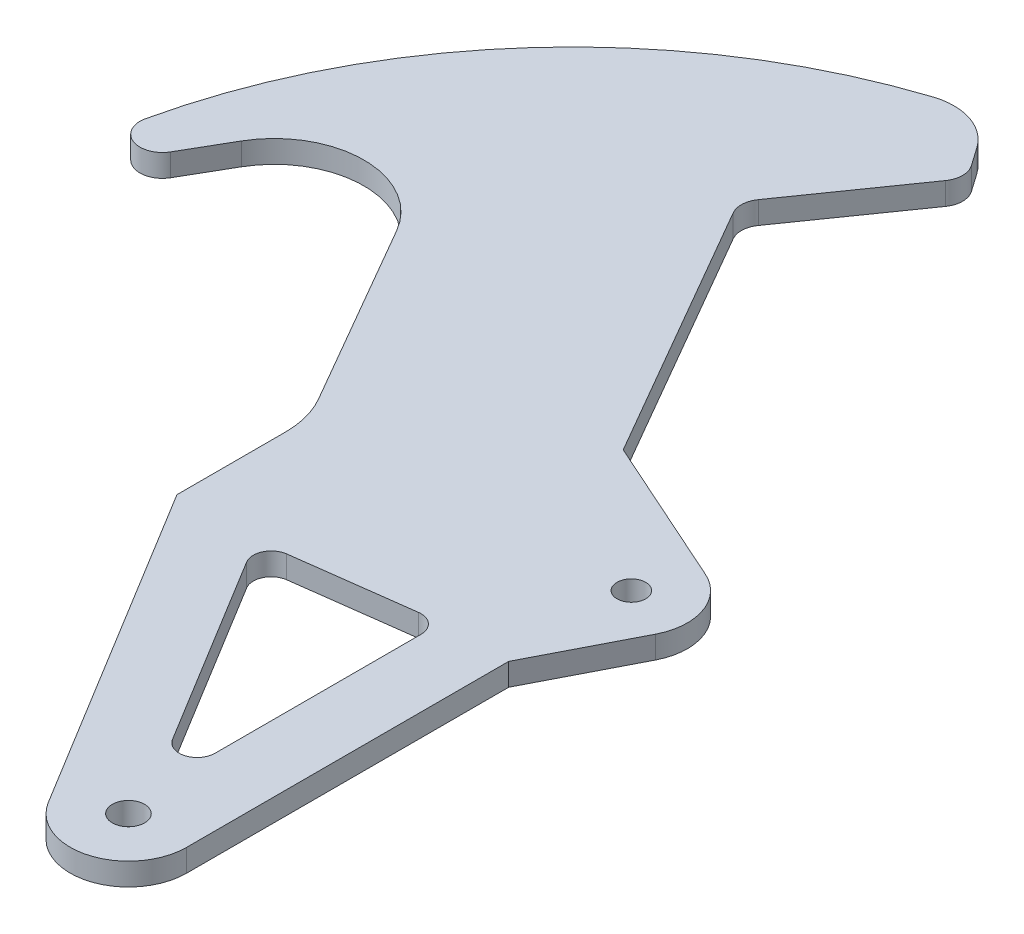
ISO-10303-21;
HEADER;
FILE_DESCRIPTION(('STEP AP214'),'2;1');
FILE_NAME('part.step','',(''),(''),'','','');
FILE_SCHEMA(('AUTOMOTIVE_DESIGN { 1 0 10303 214 1 1 1 1 }'));
ENDSEC;
DATA;
#1=APPLICATION_CONTEXT('core data for automotive mechanical design processes');
#2=APPLICATION_PROTOCOL_DEFINITION('international standard','automotive_design',2000,#1);
#3=PRODUCT_CONTEXT('',#1,'mechanical');
#4=PRODUCT('Part','Part','',(#3));
#5=PRODUCT_RELATED_PRODUCT_CATEGORY('part','',(#4));
#6=PRODUCT_DEFINITION_FORMATION('','',#4);
#7=PRODUCT_DEFINITION_CONTEXT('part definition',#1,'design');
#8=PRODUCT_DEFINITION('design','',#6,#7);
#9=PRODUCT_DEFINITION_SHAPE('','',#8);
#10=(LENGTH_UNIT() NAMED_UNIT(*) SI_UNIT(.MILLI.,.METRE.));
#11=(NAMED_UNIT(*) PLANE_ANGLE_UNIT() SI_UNIT($,.RADIAN.));
#12=(NAMED_UNIT(*) SI_UNIT($,.STERADIAN.) SOLID_ANGLE_UNIT());
#13=UNCERTAINTY_MEASURE_WITH_UNIT(LENGTH_MEASURE(1.E-05),#10,'distance_accuracy_value','');
#14=(GEOMETRIC_REPRESENTATION_CONTEXT(3) GLOBAL_UNCERTAINTY_ASSIGNED_CONTEXT((#13)) GLOBAL_UNIT_ASSIGNED_CONTEXT((#10,
#11,#12)) REPRESENTATION_CONTEXT('',''));
#15=CARTESIAN_POINT('',(0.,0.,0.));
#16=DIRECTION('',(0.,0.,1.));
#17=DIRECTION('',(1.,0.,0.));
#18=AXIS2_PLACEMENT_3D('',#15,#16,#17);
#19=CARTESIAN_POINT('',(0.,3.175,-17.4625));
#20=DIRECTION('',(0.,-1.,0.));
#21=DIRECTION('',(0.,0.,-1.));
#22=AXIS2_PLACEMENT_3D('',#19,#20,#21);
#23=PLANE('',#22);
#24=DIRECTION('',(0.,0.,-1.));
#25=VECTOR('',#24,1.);
#26=CARTESIAN_POINT('',(62.23,3.175,21.0815421831651));
#27=LINE('',#26,#25);
#28=CARTESIAN_POINT('',(62.23,3.175,53.1350747203319));
#29=VERTEX_POINT('',#28);
#30=CARTESIAN_POINT('',(62.23,3.175,23.9764163032682));
#31=VERTEX_POINT('',#30);
#32=EDGE_CURVE('E299',#29,#31,#27,.T.);
#33=ORIENTED_EDGE('',*,*,#32,.F.);
#34=CARTESIAN_POINT('',(59.69,3.175,53.1350747203319));
#35=DIRECTION('',(0.,-1.,0.));
#36=DIRECTION('',(0.,0.,-1.));
#37=AXIS2_PLACEMENT_3D('',#34,#35,#36);
#38=CIRCLE('',#37,2.54);
#39=CARTESIAN_POINT('',(57.5227237778206,3.175,54.4596553244386));
#40=VERTEX_POINT('',#39);
#41=EDGE_CURVE('E57',#29,#40,#38,.T.);
#42=ORIENTED_EDGE('',*,*,#41,.T.);
#43=DIRECTION('',(0.521488426813693,0.,0.853258355188731));
#44=VECTOR('',#43,1.);
#45=CARTESIAN_POINT('',(62.23,3.175,62.1616915734439));
#46=LINE('',#45,#44);
#47=CARTESIAN_POINT('',(41.0241922292437,3.175,27.4647899193097));
#48=VERTEX_POINT('',#47);
#49=EDGE_CURVE('E297',#48,#40,#46,.T.);
#50=ORIENTED_EDGE('',*,*,#49,.F.);
#51=CARTESIAN_POINT('',(43.1914684514231,3.175,26.1402093152029));
#52=DIRECTION('',(0.,-1.,0.));
#53=DIRECTION('',(0.,0.,-1.));
#54=AXIS2_PLACEMENT_3D('',#51,#52,#53);
#55=CIRCLE('',#54,2.54);
#56=CARTESIAN_POINT('',(42.8611743192099,3.175,23.6217761145351));
#57=VERTEX_POINT('',#56);
#58=EDGE_CURVE('E289',#48,#57,#55,.T.);
#59=ORIENTED_EDGE('',*,*,#58,.T.);
#60=DIRECTION('',(-0.991509134121156,0.,0.130037059926449));
#61=VECTOR('',#60,1.);
#62=CARTESIAN_POINT('',(38.9860588336554,3.175,24.13));
#63=LINE('',#62,#61);
#64=CARTESIAN_POINT('',(59.3597058677868,3.175,21.4579831026005));
#65=VERTEX_POINT('',#64);
#66=EDGE_CURVE('E324',#65,#57,#63,.T.);
#67=ORIENTED_EDGE('',*,*,#66,.F.);
#68=CARTESIAN_POINT('',(59.69,3.175,23.9764163032682));
#69=DIRECTION('',(0.,-1.,0.));
#70=DIRECTION('',(0.,0.,-1.));
#71=AXIS2_PLACEMENT_3D('',#68,#69,#70);
#72=CIRCLE('',#71,2.54);
#73=EDGE_CURVE('E283',#65,#31,#72,.T.);
#74=ORIENTED_EDGE('',*,*,#73,.T.);
#75=EDGE_LOOP('',(#33,#42,#50,#59,#67,#74));
#76=FACE_BOUND('',#75,.T.);
#77=CARTESIAN_POINT('',(0.,3.175,-17.4625));
#78=DIRECTION('',(0.,-1.,0.));
#79=DIRECTION('',(0.,0.,-1.));
#80=AXIS2_PLACEMENT_3D('',#77,#78,#79);
#81=CIRCLE('',#80,12.7000000000001);
#82=CARTESIAN_POINT('',(-10.9985226280625,3.175,-23.8125));
#83=VERTEX_POINT('',#82);
#84=CARTESIAN_POINT('',(10.9985226280624,3.175,-23.8125));
#85=VERTEX_POINT('',#84);
#86=EDGE_CURVE('E241',#83,#85,#81,.T.);
#87=ORIENTED_EDGE('',*,*,#86,.T.);
#88=DIRECTION('',(0.500000000000001,0.,0.866025403784438));
#89=VECTOR('',#88,1.);
#90=CARTESIAN_POINT('',(10.9985226280624,3.175,-23.8125));
#91=LINE('',#90,#89);
#92=CARTESIAN_POINT('',(26.1214912416482,3.175,2.38124999999995));
#93=VERTEX_POINT('',#92);
#94=EDGE_CURVE('E229',#85,#93,#91,.T.);
#95=ORIENTED_EDGE('',*,*,#94,.T.);
#96=CARTESIAN_POINT('',(15.1229686135857,3.175,8.73125));
#97=DIRECTION('',(0.,-1.,0.));
#98=DIRECTION('',(0.,0.,-1.));
#99=AXIS2_PLACEMENT_3D('',#96,#97,#98);
#100=CIRCLE('',#99,12.7000000000001);
#101=CARTESIAN_POINT('',(27.8229686135858,3.175,8.73125));
#102=VERTEX_POINT('',#101);
#103=EDGE_CURVE('E240',#93,#102,#100,.T.);
#104=ORIENTED_EDGE('',*,*,#103,.T.);
#105=DIRECTION('',(0.,0.,1.));
#106=VECTOR('',#105,1.);
#107=CARTESIAN_POINT('',(27.8229686135859,3.175,8.73125));
#108=LINE('',#107,#106);
#109=CARTESIAN_POINT('',(27.8229686135858,3.175,24.13));
#110=VERTEX_POINT('',#109);
#111=EDGE_CURVE('E349',#102,#110,#108,.T.);
#112=ORIENTED_EDGE('',*,*,#111,.T.);
#113=DIRECTION('',(0.521488426813693,0.,0.853258355188732));
#114=VECTOR('',#113,1.);
#115=CARTESIAN_POINT('',(27.8229686135858,3.175,24.13));
#116=LINE('',#115,#114);
#117=CARTESIAN_POINT('',(56.456352277917,3.175,70.979886963347));
#118=VERTEX_POINT('',#117);
#119=EDGE_CURVE('E352',#110,#118,#116,.T.);
#120=ORIENTED_EDGE('',*,*,#119,.T.);
#121=CARTESIAN_POINT('',(63.5,3.175,66.675));
#122=DIRECTION('',(0.,1.,0.));
#123=DIRECTION('',(0.,0.,1.));
#124=AXIS2_PLACEMENT_3D('',#121,#122,#123);
#125=CIRCLE('',#124,8.25500000000001);
#126=CARTESIAN_POINT('',(71.755,3.175,66.675));
#127=VERTEX_POINT('',#126);
#128=EDGE_CURVE('E355',#118,#127,#125,.T.);
#129=ORIENTED_EDGE('',*,*,#128,.T.);
#130=DIRECTION('',(0.,0.,-1.));
#131=VECTOR('',#130,1.);
#132=CARTESIAN_POINT('',(71.755,3.175,66.675));
#133=LINE('',#132,#131);
#134=CARTESIAN_POINT('',(71.755,3.175,21.0815421831651));
#135=VERTEX_POINT('',#134);
#136=EDGE_CURVE('E358',#127,#135,#133,.T.);
#137=ORIENTED_EDGE('',*,*,#136,.T.);
#138=DIRECTION('',(0.457027054721787,0.,-0.889452793155617));
#139=VECTOR('',#138,1.);
#140=CARTESIAN_POINT('',(71.755,3.175,21.0815421831651));
#141=LINE('',#140,#139);
#142=CARTESIAN_POINT('',(78.8150315456727,3.175,7.34151363739771));
#143=VERTEX_POINT('',#142);
#144=EDGE_CURVE('E361',#135,#143,#141,.T.);
#145=ORIENTED_EDGE('',*,*,#144,.T.);
#146=CARTESIAN_POINT('',(71.755,3.175,3.71386139054353));
#147=DIRECTION('',(0.,1.,0.));
#148=DIRECTION('',(0.,0.,1.));
#149=AXIS2_PLACEMENT_3D('',#146,#147,#148);
#150=CIRCLE('',#149,7.93750000000001);
#151=CARTESIAN_POINT('',(74.9982461501024,3.175,-3.53080980005209));
#152=VERTEX_POINT('',#151);
#153=EDGE_CURVE('E364',#143,#152,#150,.T.);
#154=ORIENTED_EDGE('',*,*,#153,.T.);
#155=DIRECTION('',(-0.912714480704959,0.,-0.408597940170379));
#156=VECTOR('',#155,1.);
#157=CARTESIAN_POINT('',(74.9982461501024,3.175,-3.53080980005209));
#158=LINE('',#157,#156);
#159=CARTESIAN_POINT('',(53.9226018811694,3.175,-12.9658138655057));
#160=VERTEX_POINT('',#159);
#161=EDGE_CURVE('E367',#152,#160,#158,.T.);
#162=ORIENTED_EDGE('',*,*,#161,.T.);
#163=DIRECTION('',(-0.5,0.,-0.866025403784439));
#164=VECTOR('',#163,1.);
#165=CARTESIAN_POINT('',(32.6501018811694,3.175,-49.8108646695147));
#166=LINE('',#165,#164);
#167=CARTESIAN_POINT('',(32.6501018811694,3.175,-49.8108646695147));
#168=VERTEX_POINT('',#167);
#169=EDGE_CURVE('E370',#160,#168,#166,.T.);
#170=ORIENTED_EDGE('',*,*,#169,.T.);
#171=CARTESIAN_POINT('',(35.399732538185,3.175,-51.3983646695146));
#172=DIRECTION('',(0.,-1.,0.));
#173=DIRECTION('',(0.,0.,1.));
#174=AXIS2_PLACEMENT_3D('',#171,#172,#173);
#175=CIRCLE('',#174,3.175);
#176=CARTESIAN_POINT('',(32.7989247975674,3.175,-53.2194698549292));
#177=VERTEX_POINT('',#176);
#178=EDGE_CURVE('E373',#168,#177,#175,.T.);
#179=ORIENTED_EDGE('',*,*,#178,.T.);
#180=DIRECTION('',(0.573576436351042,0.,-0.819152044288994));
#181=VECTOR('',#180,1.);
#182=CARTESIAN_POINT('',(32.7989247975674,3.175,-53.2194698549292));
#183=LINE('',#182,#181);
#184=CARTESIAN_POINT('',(43.7255559100548,3.175,-68.8243162986346));
#185=VERTEX_POINT('',#184);
#186=EDGE_CURVE('E376',#177,#185,#183,.T.);
#187=ORIENTED_EDGE('',*,*,#186,.T.);
#188=CARTESIAN_POINT('',(41.1247481694372,3.175,-70.6454214840491));
#189=DIRECTION('',(0.,1.,0.));
#190=DIRECTION('',(0.,0.,1.));
#191=AXIS2_PLACEMENT_3D('',#188,#189,#190);
#192=CIRCLE('',#191,3.175);
#193=CARTESIAN_POINT('',(43.7255559100548,3.175,-72.4665266694637));
#194=VERTEX_POINT('',#193);
#195=EDGE_CURVE('E379',#185,#194,#192,.T.);
#196=ORIENTED_EDGE('',*,*,#195,.T.);
#197=DIRECTION('',(-0.573576436351042,0.,-0.819152044288995));
#198=VECTOR('',#197,1.);
#199=CARTESIAN_POINT('',(41.9044507246402,3.175,-75.0673344100812));
#200=LINE('',#199,#198);
#201=CARTESIAN_POINT('',(41.9044507246402,3.175,-75.0673344100812));
#202=VERTEX_POINT('',#201);
#203=EDGE_CURVE('E382',#194,#202,#200,.T.);
#204=ORIENTED_EDGE('',*,*,#203,.T.);
#205=CARTESIAN_POINT('',(35.1423505990346,3.175,-70.3324609280034));
#206=DIRECTION('',(0.,1.,0.));
#207=DIRECTION('',(0.,0.,1.));
#208=AXIS2_PLACEMENT_3D('',#205,#206,#207);
#209=CIRCLE('',#208,8.25499999999999);
#210=CARTESIAN_POINT('',(32.5941511916014,3.175,-78.1843208847243));
#211=VERTEX_POINT('',#210);
#212=EDGE_CURVE('E385',#202,#211,#209,.T.);
#213=ORIENTED_EDGE('',*,*,#212,.T.);
#214=CARTESIAN_POINT('',(57.15,3.175,-2.51948657092369));
#215=DIRECTION('',(0.,1.,0.));
#216=DIRECTION('',(0.,0.,-1.));
#217=AXIS2_PLACEMENT_3D('',#214,#215,#216);
#218=CIRCLE('',#217,79.5497131511851);
#219=CARTESIAN_POINT('',(-20.514067317038,3.175,-19.7371957742535));
#220=VERTEX_POINT('',#219);
#221=EDGE_CURVE('E388',#211,#220,#218,.T.);
#222=ORIENTED_EDGE('',*,*,#221,.T.);
#223=CARTESIAN_POINT('',(-17.4143274944322,3.175,-19.05));
#224=DIRECTION('',(0.,1.,0.));
#225=DIRECTION('',(0.,0.,1.));
#226=AXIS2_PLACEMENT_3D('',#223,#224,#225);
#227=CIRCLE('',#226,3.175);
#228=CARTESIAN_POINT('',(-14.6646968374166,3.175,-17.4625));
#229=VERTEX_POINT('',#228);
#230=EDGE_CURVE('E391',#220,#229,#227,.T.);
#231=ORIENTED_EDGE('',*,*,#230,.T.);
#232=DIRECTION('',(0.500000000000004,0.,-0.866025403784436));
#233=VECTOR('',#232,1.);
#234=CARTESIAN_POINT('',(-10.9985226280625,3.175,-23.8125));
#235=LINE('',#234,#233);
#236=EDGE_CURVE('E246',#229,#83,#235,.T.);
#237=ORIENTED_EDGE('',*,*,#236,.T.);
#238=EDGE_LOOP('',(#87,#95,#104,#112,#120,#129,#137,#145,#154,#162,#170,#179,#187,#196,#204,
#213,#222,#231,#237));
#239=FACE_BOUND('',#238,.T.);
#240=CARTESIAN_POINT('',(63.5,3.175,66.675));
#241=DIRECTION('',(0.,1.,0.));
#242=DIRECTION('',(0.,0.,1.));
#243=AXIS2_PLACEMENT_3D('',#240,#241,#242);
#244=CIRCLE('',#243,2.28599999999998);
#245=CARTESIAN_POINT('',(63.5,3.175,68.961));
#246=VERTEX_POINT('',#245);
#247=EDGE_CURVE('E340',#246,#246,#244,.T.);
#248=ORIENTED_EDGE('',*,*,#247,.F.);
#249=EDGE_LOOP('',(#248));
#250=FACE_BOUND('',#249,.T.);
#251=CARTESIAN_POINT('',(71.755,3.175,3.71386139054353));
#252=DIRECTION('',(0.,1.,0.));
#253=DIRECTION('',(0.,0.,1.));
#254=AXIS2_PLACEMENT_3D('',#251,#252,#253);
#255=CIRCLE('',#254,2.03200000000001);
#256=CARTESIAN_POINT('',(71.755,3.175,5.74586139054353));
#257=VERTEX_POINT('',#256);
#258=EDGE_CURVE('E332',#257,#257,#255,.T.);
#259=ORIENTED_EDGE('',*,*,#258,.F.);
#260=EDGE_LOOP('',(#259));
#261=FACE_BOUND('',#260,.T.);
#262=ADVANCED_FACE('F48',(#76,#239,#250,#261),#23,.F.);
#263=CARTESIAN_POINT('',(0.,0.,-17.4625));
#264=DIRECTION('',(0.,-1.,0.));
#265=DIRECTION('',(0.,0.,-1.));
#266=AXIS2_PLACEMENT_3D('',#263,#264,#265);
#267=PLANE('',#266);
#268=DIRECTION('',(-0.991509134121156,0.,0.130037059926449));
#269=VECTOR('',#268,1.);
#270=CARTESIAN_POINT('',(38.9860588336554,0.,24.13));
#271=LINE('',#270,#269);
#272=CARTESIAN_POINT('',(59.3597058677868,0.,21.4579831026005));
#273=VERTEX_POINT('',#272);
#274=CARTESIAN_POINT('',(42.8611743192099,0.,23.6217761145351));
#275=VERTEX_POINT('',#274);
#276=EDGE_CURVE('E318',#273,#275,#271,.T.);
#277=ORIENTED_EDGE('',*,*,#276,.T.);
#278=CARTESIAN_POINT('',(43.1914684514231,0.,26.1402093152029));
#279=DIRECTION('',(0.,-1.,0.));
#280=DIRECTION('',(0.,0.,-1.));
#281=AXIS2_PLACEMENT_3D('',#278,#279,#280);
#282=CIRCLE('',#281,2.54);
#283=CARTESIAN_POINT('',(41.0241922292437,0.,27.4647899193097));
#284=VERTEX_POINT('',#283);
#285=EDGE_CURVE('E71',#275,#284,#282,.F.);
#286=ORIENTED_EDGE('',*,*,#285,.T.);
#287=DIRECTION('',(0.521488426813693,0.,0.853258355188731));
#288=VECTOR('',#287,1.);
#289=CARTESIAN_POINT('',(62.23,0.,62.1616915734439));
#290=LINE('',#289,#288);
#291=CARTESIAN_POINT('',(57.5227237778206,0.,54.4596553244386));
#292=VERTEX_POINT('',#291);
#293=EDGE_CURVE('E313',#284,#292,#290,.T.);
#294=ORIENTED_EDGE('',*,*,#293,.T.);
#295=CARTESIAN_POINT('',(59.69,0.,53.1350747203319));
#296=DIRECTION('',(0.,-1.,0.));
#297=DIRECTION('',(0.,0.,-1.));
#298=AXIS2_PLACEMENT_3D('',#295,#296,#297);
#299=CIRCLE('',#298,2.54);
#300=CARTESIAN_POINT('',(62.23,0.,53.1350747203319));
#301=VERTEX_POINT('',#300);
#302=EDGE_CURVE('E11',#292,#301,#299,.F.);
#303=ORIENTED_EDGE('',*,*,#302,.T.);
#304=DIRECTION('',(0.,0.,-1.));
#305=VECTOR('',#304,1.);
#306=CARTESIAN_POINT('',(62.23,0.,21.0815421831651));
#307=LINE('',#306,#305);
#308=CARTESIAN_POINT('',(62.23,0.,23.9764163032682));
#309=VERTEX_POINT('',#308);
#310=EDGE_CURVE('E311',#301,#309,#307,.T.);
#311=ORIENTED_EDGE('',*,*,#310,.T.);
#312=CARTESIAN_POINT('',(59.69,0.,23.9764163032682));
#313=DIRECTION('',(0.,-1.,0.));
#314=DIRECTION('',(0.,0.,-1.));
#315=AXIS2_PLACEMENT_3D('',#312,#313,#314);
#316=CIRCLE('',#315,2.54);
#317=EDGE_CURVE('E286',#309,#273,#316,.F.);
#318=ORIENTED_EDGE('',*,*,#317,.T.);
#319=EDGE_LOOP('',(#277,#286,#294,#303,#311,#318));
#320=FACE_BOUND('',#319,.T.);
#321=CARTESIAN_POINT('',(63.5,0.,66.675));
#322=DIRECTION('',(0.,1.,0.));
#323=DIRECTION('',(0.,0.,1.));
#324=AXIS2_PLACEMENT_3D('',#321,#322,#323);
#325=CIRCLE('',#324,2.28599999999998);
#326=CARTESIAN_POINT('',(63.5,0.,68.961));
#327=VERTEX_POINT('',#326);
#328=EDGE_CURVE('E336',#327,#327,#325,.T.);
#329=ORIENTED_EDGE('',*,*,#328,.T.);
#330=EDGE_LOOP('',(#329));
#331=FACE_BOUND('',#330,.T.);
#332=CARTESIAN_POINT('',(0.,0.,-17.4625));
#333=DIRECTION('',(0.,-1.,0.));
#334=DIRECTION('',(0.,0.,-1.));
#335=AXIS2_PLACEMENT_3D('',#332,#333,#334);
#336=CIRCLE('',#335,12.7000000000001);
#337=CARTESIAN_POINT('',(-10.9985226280625,0.,-23.8125));
#338=VERTEX_POINT('',#337);
#339=CARTESIAN_POINT('',(10.9985226280624,0.,-23.8125));
#340=VERTEX_POINT('',#339);
#341=EDGE_CURVE('E255',#338,#340,#336,.T.);
#342=ORIENTED_EDGE('',*,*,#341,.F.);
#343=DIRECTION('',(0.500000000000004,0.,-0.866025403784436));
#344=VECTOR('',#343,1.);
#345=CARTESIAN_POINT('',(-10.9985226280625,0.,-23.8125));
#346=LINE('',#345,#344);
#347=CARTESIAN_POINT('',(-14.6646968374166,0.,-17.4625));
#348=VERTEX_POINT('',#347);
#349=EDGE_CURVE('E251',#348,#338,#346,.T.);
#350=ORIENTED_EDGE('',*,*,#349,.F.);
#351=CARTESIAN_POINT('',(-17.4143274944322,0.,-19.05));
#352=DIRECTION('',(0.,1.,0.));
#353=DIRECTION('',(0.,0.,1.));
#354=AXIS2_PLACEMENT_3D('',#351,#352,#353);
#355=CIRCLE('',#354,3.175);
#356=CARTESIAN_POINT('',(-20.514067317038,0.,-19.7371957742535));
#357=VERTEX_POINT('',#356);
#358=EDGE_CURVE('E447',#357,#348,#355,.T.);
#359=ORIENTED_EDGE('',*,*,#358,.F.);
#360=CARTESIAN_POINT('',(57.15,0.,-2.51948657092369));
#361=DIRECTION('',(0.,1.,0.));
#362=DIRECTION('',(0.,0.,-1.));
#363=AXIS2_PLACEMENT_3D('',#360,#361,#362);
#364=CIRCLE('',#363,79.5497131511851);
#365=CARTESIAN_POINT('',(32.5941511916014,0.,-78.1843208847243));
#366=VERTEX_POINT('',#365);
#367=EDGE_CURVE('E444',#366,#357,#364,.T.);
#368=ORIENTED_EDGE('',*,*,#367,.F.);
#369=CARTESIAN_POINT('',(35.1423505990346,0.,-70.3324609280034));
#370=DIRECTION('',(0.,1.,0.));
#371=DIRECTION('',(0.,0.,1.));
#372=AXIS2_PLACEMENT_3D('',#369,#370,#371);
#373=CIRCLE('',#372,8.25499999999999);
#374=CARTESIAN_POINT('',(41.9044507246402,0.,-75.0673344100812));
#375=VERTEX_POINT('',#374);
#376=EDGE_CURVE('E441',#375,#366,#373,.T.);
#377=ORIENTED_EDGE('',*,*,#376,.F.);
#378=DIRECTION('',(-0.573576436351042,0.,-0.819152044288995));
#379=VECTOR('',#378,1.);
#380=CARTESIAN_POINT('',(41.9044507246402,0.,-75.0673344100812));
#381=LINE('',#380,#379);
#382=CARTESIAN_POINT('',(43.7255559100548,0.,-72.4665266694637));
#383=VERTEX_POINT('',#382);
#384=EDGE_CURVE('E438',#383,#375,#381,.T.);
#385=ORIENTED_EDGE('',*,*,#384,.F.);
#386=CARTESIAN_POINT('',(41.1247481694372,0.,-70.6454214840491));
#387=DIRECTION('',(0.,1.,0.));
#388=DIRECTION('',(0.,0.,1.));
#389=AXIS2_PLACEMENT_3D('',#386,#387,#388);
#390=CIRCLE('',#389,3.175);
#391=CARTESIAN_POINT('',(43.7255559100548,0.,-68.8243162986346));
#392=VERTEX_POINT('',#391);
#393=EDGE_CURVE('E435',#392,#383,#390,.T.);
#394=ORIENTED_EDGE('',*,*,#393,.F.);
#395=DIRECTION('',(0.573576436351042,0.,-0.819152044288994));
#396=VECTOR('',#395,1.);
#397=CARTESIAN_POINT('',(32.7989247975674,0.,-53.2194698549292));
#398=LINE('',#397,#396);
#399=CARTESIAN_POINT('',(32.7989247975674,0.,-53.2194698549292));
#400=VERTEX_POINT('',#399);
#401=EDGE_CURVE('E432',#400,#392,#398,.T.);
#402=ORIENTED_EDGE('',*,*,#401,.F.);
#403=CARTESIAN_POINT('',(35.399732538185,0.,-51.3983646695146));
#404=DIRECTION('',(0.,-1.,0.));
#405=DIRECTION('',(0.,0.,1.));
#406=AXIS2_PLACEMENT_3D('',#403,#404,#405);
#407=CIRCLE('',#406,3.175);
#408=CARTESIAN_POINT('',(32.6501018811694,0.,-49.8108646695147));
#409=VERTEX_POINT('',#408);
#410=EDGE_CURVE('E429',#409,#400,#407,.T.);
#411=ORIENTED_EDGE('',*,*,#410,.F.);
#412=DIRECTION('',(-0.5,0.,-0.866025403784439));
#413=VECTOR('',#412,1.);
#414=CARTESIAN_POINT('',(32.6501018811694,0.,-49.8108646695147));
#415=LINE('',#414,#413);
#416=CARTESIAN_POINT('',(53.9226018811694,0.,-12.9658138655057));
#417=VERTEX_POINT('',#416);
#418=EDGE_CURVE('E426',#417,#409,#415,.T.);
#419=ORIENTED_EDGE('',*,*,#418,.F.);
#420=DIRECTION('',(-0.912714480704959,0.,-0.408597940170379));
#421=VECTOR('',#420,1.);
#422=CARTESIAN_POINT('',(74.9982461501024,0.,-3.53080980005209));
#423=LINE('',#422,#421);
#424=CARTESIAN_POINT('',(74.9982461501024,0.,-3.53080980005209));
#425=VERTEX_POINT('',#424);
#426=EDGE_CURVE('E423',#425,#417,#423,.T.);
#427=ORIENTED_EDGE('',*,*,#426,.F.);
#428=CARTESIAN_POINT('',(71.755,0.,3.71386139054353));
#429=DIRECTION('',(0.,1.,0.));
#430=DIRECTION('',(0.,0.,1.));
#431=AXIS2_PLACEMENT_3D('',#428,#429,#430);
#432=CIRCLE('',#431,7.93750000000001);
#433=CARTESIAN_POINT('',(78.8150315456727,0.,7.34151363739771));
#434=VERTEX_POINT('',#433);
#435=EDGE_CURVE('E420',#434,#425,#432,.T.);
#436=ORIENTED_EDGE('',*,*,#435,.F.);
#437=DIRECTION('',(0.457027054721787,0.,-0.889452793155617));
#438=VECTOR('',#437,1.);
#439=CARTESIAN_POINT('',(71.755,0.,21.0815421831651));
#440=LINE('',#439,#438);
#441=CARTESIAN_POINT('',(71.755,0.,21.0815421831651));
#442=VERTEX_POINT('',#441);
#443=EDGE_CURVE('E417',#442,#434,#440,.T.);
#444=ORIENTED_EDGE('',*,*,#443,.F.);
#445=DIRECTION('',(0.,0.,-1.));
#446=VECTOR('',#445,1.);
#447=CARTESIAN_POINT('',(71.755,0.,66.675));
#448=LINE('',#447,#446);
#449=CARTESIAN_POINT('',(71.755,0.,66.675));
#450=VERTEX_POINT('',#449);
#451=EDGE_CURVE('E414',#450,#442,#448,.T.);
#452=ORIENTED_EDGE('',*,*,#451,.F.);
#453=CARTESIAN_POINT('',(63.5,0.,66.675));
#454=DIRECTION('',(0.,1.,0.));
#455=DIRECTION('',(0.,0.,1.));
#456=AXIS2_PLACEMENT_3D('',#453,#454,#455);
#457=CIRCLE('',#456,8.25500000000001);
#458=CARTESIAN_POINT('',(56.456352277917,0.,70.979886963347));
#459=VERTEX_POINT('',#458);
#460=EDGE_CURVE('E411',#459,#450,#457,.T.);
#461=ORIENTED_EDGE('',*,*,#460,.F.);
#462=DIRECTION('',(0.521488426813693,0.,0.853258355188732));
#463=VECTOR('',#462,1.);
#464=CARTESIAN_POINT('',(27.8229686135858,0.,24.13));
#465=LINE('',#464,#463);
#466=CARTESIAN_POINT('',(27.8229686135858,0.,24.13));
#467=VERTEX_POINT('',#466);
#468=EDGE_CURVE('E408',#467,#459,#465,.T.);
#469=ORIENTED_EDGE('',*,*,#468,.F.);
#470=DIRECTION('',(0.,0.,1.));
#471=VECTOR('',#470,1.);
#472=CARTESIAN_POINT('',(27.8229686135859,0.,8.73125));
#473=LINE('',#472,#471);
#474=CARTESIAN_POINT('',(27.8229686135858,0.,8.73125));
#475=VERTEX_POINT('',#474);
#476=EDGE_CURVE('E405',#475,#467,#473,.T.);
#477=ORIENTED_EDGE('',*,*,#476,.F.);
#478=CARTESIAN_POINT('',(15.1229686135857,0.,8.73125));
#479=DIRECTION('',(0.,-1.,0.));
#480=DIRECTION('',(0.,0.,-1.));
#481=AXIS2_PLACEMENT_3D('',#478,#479,#480);
#482=CIRCLE('',#481,12.7000000000001);
#483=CARTESIAN_POINT('',(26.1214912416482,0.,2.38124999999995));
#484=VERTEX_POINT('',#483);
#485=EDGE_CURVE('E402',#484,#475,#482,.T.);
#486=ORIENTED_EDGE('',*,*,#485,.F.);
#487=DIRECTION('',(0.500000000000001,0.,0.866025403784438));
#488=VECTOR('',#487,1.);
#489=CARTESIAN_POINT('',(10.9985226280624,0.,-23.8125));
#490=LINE('',#489,#488);
#491=EDGE_CURVE('E399',#340,#484,#490,.T.);
#492=ORIENTED_EDGE('',*,*,#491,.F.);
#493=EDGE_LOOP('',(#342,#350,#359,#368,#377,#385,#394,#402,#411,#419,#427,#436,#444,#452,#461,
#469,#477,#486,#492));
#494=FACE_BOUND('',#493,.T.);
#495=CARTESIAN_POINT('',(71.755,0.,3.71386139054353));
#496=DIRECTION('',(0.,1.,0.));
#497=DIRECTION('',(0.,0.,1.));
#498=AXIS2_PLACEMENT_3D('',#495,#496,#497);
#499=CIRCLE('',#498,2.03200000000001);
#500=CARTESIAN_POINT('',(71.755,0.,5.74586139054353));
#501=VERTEX_POINT('',#500);
#502=EDGE_CURVE('E321',#501,#501,#499,.T.);
#503=ORIENTED_EDGE('',*,*,#502,.T.);
#504=EDGE_LOOP('',(#503));
#505=FACE_BOUND('',#504,.T.);
#506=ADVANCED_FACE('F309',(#320,#331,#494,#505),#267,.T.);
#507=CARTESIAN_POINT('',(0.,3.175,-17.4625));
#508=DIRECTION('',(0.,-1.,0.));
#509=DIRECTION('',(0.,0.,-1.));
#510=AXIS2_PLACEMENT_3D('',#507,#508,#509);
#511=CYLINDRICAL_SURFACE('',#510,12.7000000000001);
#512=ORIENTED_EDGE('',*,*,#341,.T.);
#513=DIRECTION('',(0.,-1.,0.));
#514=VECTOR('',#513,1.);
#515=CARTESIAN_POINT('',(10.9985226280624,3.175,-23.8125));
#516=LINE('',#515,#514);
#517=EDGE_CURVE('E233',#85,#340,#516,.T.);
#518=ORIENTED_EDGE('',*,*,#517,.F.);
#519=ORIENTED_EDGE('',*,*,#86,.F.);
#520=DIRECTION('',(0.,-1.,0.));
#521=VECTOR('',#520,1.);
#522=CARTESIAN_POINT('',(-10.9985226280625,3.175,-23.8125));
#523=LINE('',#522,#521);
#524=EDGE_CURVE('E396',#83,#338,#523,.T.);
#525=ORIENTED_EDGE('',*,*,#524,.T.);
#526=EDGE_LOOP('',(#512,#518,#519,#525));
#527=FACE_BOUND('',#526,.T.);
#528=ADVANCED_FACE('F253',(#527),#511,.F.);
#529=CARTESIAN_POINT('',(10.9985226280624,3.175,-23.8125));
#530=DIRECTION('',(0.866025403784438,0.,-0.500000000000001));
#531=DIRECTION('',(-0.500000000000001,0.,-0.866025403784438));
#532=AXIS2_PLACEMENT_3D('',#529,#530,#531);
#533=PLANE('',#532);
#534=ORIENTED_EDGE('',*,*,#491,.T.);
#535=DIRECTION('',(0.,-1.,0.));
#536=VECTOR('',#535,1.);
#537=CARTESIAN_POINT('',(26.1214912416482,3.175,2.38124999999995));
#538=LINE('',#537,#536);
#539=EDGE_CURVE('E236',#93,#484,#538,.T.);
#540=ORIENTED_EDGE('',*,*,#539,.F.);
#541=ORIENTED_EDGE('',*,*,#94,.F.);
#542=ORIENTED_EDGE('',*,*,#517,.T.);
#543=EDGE_LOOP('',(#534,#540,#541,#542));
#544=FACE_BOUND('',#543,.T.);
#545=ADVANCED_FACE('F231',(#544),#533,.F.);
#546=CARTESIAN_POINT('',(15.1229686135857,3.175,8.73125));
#547=DIRECTION('',(0.,-1.,0.));
#548=DIRECTION('',(0.,0.,-1.));
#549=AXIS2_PLACEMENT_3D('',#546,#547,#548);
#550=CYLINDRICAL_SURFACE('',#549,12.7000000000001);
#551=ORIENTED_EDGE('',*,*,#485,.T.);
#552=DIRECTION('',(0.,-1.,0.));
#553=VECTOR('',#552,1.);
#554=CARTESIAN_POINT('',(27.8229686135858,3.175,8.73125));
#555=LINE('',#554,#553);
#556=EDGE_CURVE('E263',#102,#475,#555,.T.);
#557=ORIENTED_EDGE('',*,*,#556,.F.);
#558=ORIENTED_EDGE('',*,*,#103,.F.);
#559=ORIENTED_EDGE('',*,*,#539,.T.);
#560=EDGE_LOOP('',(#551,#557,#558,#559));
#561=FACE_BOUND('',#560,.T.);
#562=ADVANCED_FACE('F538',(#561),#550,.F.);
#563=CARTESIAN_POINT('',(27.8229686135859,3.175,8.73125));
#564=DIRECTION('',(1.,0.,0.));
#565=DIRECTION('',(0.,0.,-1.));
#566=AXIS2_PLACEMENT_3D('',#563,#564,#565);
#567=PLANE('',#566);
#568=ORIENTED_EDGE('',*,*,#476,.T.);
#569=DIRECTION('',(0.,-1.,0.));
#570=VECTOR('',#569,1.);
#571=CARTESIAN_POINT('',(27.8229686135858,3.175,24.13));
#572=LINE('',#571,#570);
#573=EDGE_CURVE('E510',#110,#467,#572,.T.);
#574=ORIENTED_EDGE('',*,*,#573,.F.);
#575=ORIENTED_EDGE('',*,*,#111,.F.);
#576=ORIENTED_EDGE('',*,*,#556,.T.);
#577=EDGE_LOOP('',(#568,#574,#575,#576));
#578=FACE_BOUND('',#577,.T.);
#579=ADVANCED_FACE('F519',(#578),#567,.F.);
#580=CARTESIAN_POINT('',(27.8229686135858,3.175,24.13));
#581=DIRECTION('',(0.853258355188732,0.,-0.521488426813693));
#582=DIRECTION('',(-0.521488426813693,0.,-0.853258355188732));
#583=AXIS2_PLACEMENT_3D('',#580,#581,#582);
#584=PLANE('',#583);
#585=ORIENTED_EDGE('',*,*,#468,.T.);
#586=DIRECTION('',(0.,-1.,0.));
#587=VECTOR('',#586,1.);
#588=CARTESIAN_POINT('',(56.456352277917,3.175,70.979886963347));
#589=LINE('',#588,#587);
#590=EDGE_CURVE('E506',#118,#459,#589,.T.);
#591=ORIENTED_EDGE('',*,*,#590,.F.);
#592=ORIENTED_EDGE('',*,*,#119,.F.);
#593=ORIENTED_EDGE('',*,*,#573,.T.);
#594=EDGE_LOOP('',(#585,#591,#592,#593));
#595=FACE_BOUND('',#594,.T.);
#596=ADVANCED_FACE('F530',(#595),#584,.F.);
#597=CARTESIAN_POINT('',(63.5,3.175,66.675));
#598=DIRECTION('',(0.,-1.,0.));
#599=DIRECTION('',(0.,0.,-1.));
#600=AXIS2_PLACEMENT_3D('',#597,#598,#599);
#601=CYLINDRICAL_SURFACE('',#600,8.25500000000001);
#602=ORIENTED_EDGE('',*,*,#460,.T.);
#603=DIRECTION('',(0.,-1.,0.));
#604=VECTOR('',#603,1.);
#605=CARTESIAN_POINT('',(71.755,3.175,66.675));
#606=LINE('',#605,#604);
#607=EDGE_CURVE('E502',#127,#450,#606,.T.);
#608=ORIENTED_EDGE('',*,*,#607,.F.);
#609=ORIENTED_EDGE('',*,*,#128,.F.);
#610=ORIENTED_EDGE('',*,*,#590,.T.);
#611=EDGE_LOOP('',(#602,#608,#609,#610));
#612=FACE_BOUND('',#611,.T.);
#613=ADVANCED_FACE('F534',(#612),#601,.T.);
#614=CARTESIAN_POINT('',(71.755,3.175,66.675));
#615=DIRECTION('',(-1.,0.,0.));
#616=DIRECTION('',(0.,0.,1.));
#617=AXIS2_PLACEMENT_3D('',#614,#615,#616);
#618=PLANE('',#617);
#619=ORIENTED_EDGE('',*,*,#451,.T.);
#620=DIRECTION('',(0.,-1.,0.));
#621=VECTOR('',#620,1.);
#622=CARTESIAN_POINT('',(71.755,3.175,21.0815421831651));
#623=LINE('',#622,#621);
#624=EDGE_CURVE('E498',#135,#442,#623,.T.);
#625=ORIENTED_EDGE('',*,*,#624,.F.);
#626=ORIENTED_EDGE('',*,*,#136,.F.);
#627=ORIENTED_EDGE('',*,*,#607,.T.);
#628=EDGE_LOOP('',(#619,#625,#626,#627));
#629=FACE_BOUND('',#628,.T.);
#630=ADVANCED_FACE('F603',(#629),#618,.F.);
#631=CARTESIAN_POINT('',(71.755,3.175,21.0815421831651));
#632=DIRECTION('',(-0.889452793155617,0.,-0.457027054721787));
#633=DIRECTION('',(-0.457027054721787,0.,0.889452793155617));
#634=AXIS2_PLACEMENT_3D('',#631,#632,#633);
#635=PLANE('',#634);
#636=ORIENTED_EDGE('',*,*,#443,.T.);
#637=DIRECTION('',(0.,-1.,0.));
#638=VECTOR('',#637,1.);
#639=CARTESIAN_POINT('',(78.8150315456727,3.175,7.34151363739771));
#640=LINE('',#639,#638);
#641=EDGE_CURVE('E494',#143,#434,#640,.T.);
#642=ORIENTED_EDGE('',*,*,#641,.F.);
#643=ORIENTED_EDGE('',*,*,#144,.F.);
#644=ORIENTED_EDGE('',*,*,#624,.T.);
#645=EDGE_LOOP('',(#636,#642,#643,#644));
#646=FACE_BOUND('',#645,.T.);
#647=ADVANCED_FACE('F599',(#646),#635,.F.);
#648=CARTESIAN_POINT('',(71.755,3.175,3.71386139054353));
#649=DIRECTION('',(0.,-1.,0.));
#650=DIRECTION('',(0.,0.,-1.));
#651=AXIS2_PLACEMENT_3D('',#648,#649,#650);
#652=CYLINDRICAL_SURFACE('',#651,7.93750000000001);
#653=ORIENTED_EDGE('',*,*,#435,.T.);
#654=DIRECTION('',(0.,-1.,0.));
#655=VECTOR('',#654,1.);
#656=CARTESIAN_POINT('',(74.9982461501024,3.175,-3.53080980005209));
#657=LINE('',#656,#655);
#658=EDGE_CURVE('E490',#152,#425,#657,.T.);
#659=ORIENTED_EDGE('',*,*,#658,.F.);
#660=ORIENTED_EDGE('',*,*,#153,.F.);
#661=ORIENTED_EDGE('',*,*,#641,.T.);
#662=EDGE_LOOP('',(#653,#659,#660,#661));
#663=FACE_BOUND('',#662,.T.);
#664=ADVANCED_FACE('F595',(#663),#652,.T.);
#665=CARTESIAN_POINT('',(74.9982461501024,3.175,-3.53080980005209));
#666=DIRECTION('',(-0.408597940170379,0.,0.912714480704959));
#667=DIRECTION('',(0.912714480704959,0.,0.408597940170379));
#668=AXIS2_PLACEMENT_3D('',#665,#666,#667);
#669=PLANE('',#668);
#670=ORIENTED_EDGE('',*,*,#426,.T.);
#671=DIRECTION('',(0.,-1.,0.));
#672=VECTOR('',#671,1.);
#673=CARTESIAN_POINT('',(53.9226018811694,3.175,-12.9658138655057));
#674=LINE('',#673,#672);
#675=EDGE_CURVE('E486',#160,#417,#674,.T.);
#676=ORIENTED_EDGE('',*,*,#675,.F.);
#677=ORIENTED_EDGE('',*,*,#161,.F.);
#678=ORIENTED_EDGE('',*,*,#658,.T.);
#679=EDGE_LOOP('',(#670,#676,#677,#678));
#680=FACE_BOUND('',#679,.T.);
#681=ADVANCED_FACE('F591',(#680),#669,.F.);
#682=CARTESIAN_POINT('',(32.6501018811694,3.175,-49.8108646695147));
#683=DIRECTION('',(-0.866025403784439,0.,0.5));
#684=DIRECTION('',(0.5,0.,0.866025403784439));
#685=AXIS2_PLACEMENT_3D('',#682,#683,#684);
#686=PLANE('',#685);
#687=ORIENTED_EDGE('',*,*,#418,.T.);
#688=DIRECTION('',(0.,-1.,0.));
#689=VECTOR('',#688,1.);
#690=CARTESIAN_POINT('',(32.6501018811694,3.175,-49.8108646695147));
#691=LINE('',#690,#689);
#692=EDGE_CURVE('E482',#168,#409,#691,.T.);
#693=ORIENTED_EDGE('',*,*,#692,.F.);
#694=ORIENTED_EDGE('',*,*,#169,.F.);
#695=ORIENTED_EDGE('',*,*,#675,.T.);
#696=EDGE_LOOP('',(#687,#693,#694,#695));
#697=FACE_BOUND('',#696,.T.);
#698=ADVANCED_FACE('F587',(#697),#686,.F.);
#699=CARTESIAN_POINT('',(35.399732538185,3.175,-51.3983646695146));
#700=DIRECTION('',(0.,-1.,0.));
#701=DIRECTION('',(0.,0.,-1.));
#702=AXIS2_PLACEMENT_3D('',#699,#700,#701);
#703=CYLINDRICAL_SURFACE('',#702,3.175);
#704=ORIENTED_EDGE('',*,*,#410,.T.);
#705=DIRECTION('',(0.,-1.,0.));
#706=VECTOR('',#705,1.);
#707=CARTESIAN_POINT('',(32.7989247975674,3.175,-53.2194698549292));
#708=LINE('',#707,#706);
#709=EDGE_CURVE('E478',#177,#400,#708,.T.);
#710=ORIENTED_EDGE('',*,*,#709,.F.);
#711=ORIENTED_EDGE('',*,*,#178,.F.);
#712=ORIENTED_EDGE('',*,*,#692,.T.);
#713=EDGE_LOOP('',(#704,#710,#711,#712));
#714=FACE_BOUND('',#713,.T.);
#715=ADVANCED_FACE('F583',(#714),#703,.F.);
#716=CARTESIAN_POINT('',(32.7989247975674,3.175,-53.2194698549292));
#717=DIRECTION('',(-0.819152044288994,0.,-0.573576436351042));
#718=DIRECTION('',(-0.573576436351042,0.,0.819152044288994));
#719=AXIS2_PLACEMENT_3D('',#716,#717,#718);
#720=PLANE('',#719);
#721=ORIENTED_EDGE('',*,*,#401,.T.);
#722=DIRECTION('',(0.,-1.,0.));
#723=VECTOR('',#722,1.);
#724=CARTESIAN_POINT('',(43.7255559100548,3.175,-68.8243162986346));
#725=LINE('',#724,#723);
#726=EDGE_CURVE('E474',#185,#392,#725,.T.);
#727=ORIENTED_EDGE('',*,*,#726,.F.);
#728=ORIENTED_EDGE('',*,*,#186,.F.);
#729=ORIENTED_EDGE('',*,*,#709,.T.);
#730=EDGE_LOOP('',(#721,#727,#728,#729));
#731=FACE_BOUND('',#730,.T.);
#732=ADVANCED_FACE('F579',(#731),#720,.F.);
#733=CARTESIAN_POINT('',(41.1247481694372,3.175,-70.6454214840491));
#734=DIRECTION('',(0.,-1.,0.));
#735=DIRECTION('',(0.,0.,-1.));
#736=AXIS2_PLACEMENT_3D('',#733,#734,#735);
#737=CYLINDRICAL_SURFACE('',#736,3.175);
#738=ORIENTED_EDGE('',*,*,#393,.T.);
#739=DIRECTION('',(0.,-1.,0.));
#740=VECTOR('',#739,1.);
#741=CARTESIAN_POINT('',(43.7255559100548,3.175,-72.4665266694637));
#742=LINE('',#741,#740);
#743=EDGE_CURVE('E470',#194,#383,#742,.T.);
#744=ORIENTED_EDGE('',*,*,#743,.F.);
#745=ORIENTED_EDGE('',*,*,#195,.F.);
#746=ORIENTED_EDGE('',*,*,#726,.T.);
#747=EDGE_LOOP('',(#738,#744,#745,#746));
#748=FACE_BOUND('',#747,.T.);
#749=ADVANCED_FACE('F575',(#748),#737,.T.);
#750=CARTESIAN_POINT('',(41.9044507246402,3.175,-75.0673344100812));
#751=DIRECTION('',(-0.819152044288995,0.,0.573576436351042));
#752=DIRECTION('',(0.573576436351042,0.,0.819152044288995));
#753=AXIS2_PLACEMENT_3D('',#750,#751,#752);
#754=PLANE('',#753);
#755=ORIENTED_EDGE('',*,*,#384,.T.);
#756=DIRECTION('',(0.,-1.,0.));
#757=VECTOR('',#756,1.);
#758=CARTESIAN_POINT('',(41.9044507246402,3.175,-75.0673344100812));
#759=LINE('',#758,#757);
#760=EDGE_CURVE('E466',#202,#375,#759,.T.);
#761=ORIENTED_EDGE('',*,*,#760,.F.);
#762=ORIENTED_EDGE('',*,*,#203,.F.);
#763=ORIENTED_EDGE('',*,*,#743,.T.);
#764=EDGE_LOOP('',(#755,#761,#762,#763));
#765=FACE_BOUND('',#764,.T.);
#766=ADVANCED_FACE('F571',(#765),#754,.F.);
#767=CARTESIAN_POINT('',(35.1423505990346,3.175,-70.3324609280034));
#768=DIRECTION('',(0.,-1.,0.));
#769=DIRECTION('',(0.,0.,-1.));
#770=AXIS2_PLACEMENT_3D('',#767,#768,#769);
#771=CYLINDRICAL_SURFACE('',#770,8.25499999999999);
#772=ORIENTED_EDGE('',*,*,#376,.T.);
#773=DIRECTION('',(0.,-1.,0.));
#774=VECTOR('',#773,1.);
#775=CARTESIAN_POINT('',(32.5941511916014,3.175,-78.1843208847243));
#776=LINE('',#775,#774);
#777=EDGE_CURVE('E462',#211,#366,#776,.T.);
#778=ORIENTED_EDGE('',*,*,#777,.F.);
#779=ORIENTED_EDGE('',*,*,#212,.F.);
#780=ORIENTED_EDGE('',*,*,#760,.T.);
#781=EDGE_LOOP('',(#772,#778,#779,#780));
#782=FACE_BOUND('',#781,.T.);
#783=ADVANCED_FACE('F567',(#782),#771,.T.);
#784=CARTESIAN_POINT('',(57.15,3.175,-2.51948657092369));
#785=DIRECTION('',(0.,-1.,0.));
#786=DIRECTION('',(0.,0.,-1.));
#787=AXIS2_PLACEMENT_3D('',#784,#785,#786);
#788=CYLINDRICAL_SURFACE('',#787,79.5497131511851);
#789=ORIENTED_EDGE('',*,*,#367,.T.);
#790=DIRECTION('',(0.,-1.,0.));
#791=VECTOR('',#790,1.);
#792=CARTESIAN_POINT('',(-20.514067317038,3.175,-19.7371957742535));
#793=LINE('',#792,#791);
#794=EDGE_CURVE('E458',#220,#357,#793,.T.);
#795=ORIENTED_EDGE('',*,*,#794,.F.);
#796=ORIENTED_EDGE('',*,*,#221,.F.);
#797=ORIENTED_EDGE('',*,*,#777,.T.);
#798=EDGE_LOOP('',(#789,#795,#796,#797));
#799=FACE_BOUND('',#798,.T.);
#800=ADVANCED_FACE('F563',(#799),#788,.T.);
#801=CARTESIAN_POINT('',(-17.4143274944322,3.175,-19.05));
#802=DIRECTION('',(0.,-1.,0.));
#803=DIRECTION('',(0.,0.,-1.));
#804=AXIS2_PLACEMENT_3D('',#801,#802,#803);
#805=CYLINDRICAL_SURFACE('',#804,3.175);
#806=ORIENTED_EDGE('',*,*,#358,.T.);
#807=DIRECTION('',(0.,-1.,0.));
#808=VECTOR('',#807,1.);
#809=CARTESIAN_POINT('',(-14.6646968374166,3.175,-17.4625));
#810=LINE('',#809,#808);
#811=EDGE_CURVE('E454',#229,#348,#810,.T.);
#812=ORIENTED_EDGE('',*,*,#811,.F.);
#813=ORIENTED_EDGE('',*,*,#230,.F.);
#814=ORIENTED_EDGE('',*,*,#794,.T.);
#815=EDGE_LOOP('',(#806,#812,#813,#814));
#816=FACE_BOUND('',#815,.T.);
#817=ADVANCED_FACE('F559',(#816),#805,.T.);
#818=CARTESIAN_POINT('',(-10.9985226280625,3.175,-23.8125));
#819=DIRECTION('',(-0.866025403784436,0.,-0.500000000000004));
#820=DIRECTION('',(-0.500000000000004,0.,0.866025403784436));
#821=AXIS2_PLACEMENT_3D('',#818,#819,#820);
#822=PLANE('',#821);
#823=ORIENTED_EDGE('',*,*,#349,.T.);
#824=ORIENTED_EDGE('',*,*,#524,.F.);
#825=ORIENTED_EDGE('',*,*,#236,.F.);
#826=ORIENTED_EDGE('',*,*,#811,.T.);
#827=EDGE_LOOP('',(#823,#824,#825,#826));
#828=FACE_BOUND('',#827,.T.);
#829=ADVANCED_FACE('F556',(#828),#822,.F.);
#830=CARTESIAN_POINT('',(63.5,3.175,66.675));
#831=DIRECTION('',(0.,-1.,0.));
#832=DIRECTION('',(0.,0.,-1.));
#833=AXIS2_PLACEMENT_3D('',#830,#831,#832);
#834=CYLINDRICAL_SURFACE('',#833,2.28599999999998);
#835=ORIENTED_EDGE('',*,*,#247,.T.);
#836=EDGE_LOOP('',(#835));
#837=FACE_BOUND('',#836,.T.);
#838=ORIENTED_EDGE('',*,*,#328,.F.);
#839=EDGE_LOOP('',(#838));
#840=FACE_BOUND('',#839,.T.);
#841=ADVANCED_FACE('F553',(#837,#840),#834,.F.);
#842=CARTESIAN_POINT('',(71.755,3.175,3.71386139054353));
#843=DIRECTION('',(0.,-1.,0.));
#844=DIRECTION('',(0.,0.,-1.));
#845=AXIS2_PLACEMENT_3D('',#842,#843,#844);
#846=CYLINDRICAL_SURFACE('',#845,2.03200000000001);
#847=ORIENTED_EDGE('',*,*,#258,.T.);
#848=EDGE_LOOP('',(#847));
#849=FACE_BOUND('',#848,.T.);
#850=ORIENTED_EDGE('',*,*,#502,.F.);
#851=EDGE_LOOP('',(#850));
#852=FACE_BOUND('',#851,.T.);
#853=ADVANCED_FACE('F692',(#849,#852),#846,.F.);
#854=CARTESIAN_POINT('',(62.23,0.,62.1616915734439));
#855=DIRECTION('',(-0.853258355188731,0.,0.521488426813693));
#856=DIRECTION('',(0.521488426813693,0.,0.853258355188731));
#857=AXIS2_PLACEMENT_3D('',#854,#855,#856);
#858=PLANE('',#857);
#859=ORIENTED_EDGE('',*,*,#293,.F.);
#860=DIRECTION('',(0.,1.,0.));
#861=VECTOR('',#860,1.);
#862=CARTESIAN_POINT('',(41.0241922292437,3.175,27.4647899193096));
#863=LINE('',#862,#861);
#864=EDGE_CURVE('E279',#284,#48,#863,.T.);
#865=ORIENTED_EDGE('',*,*,#864,.T.);
#866=ORIENTED_EDGE('',*,*,#49,.T.);
#867=DIRECTION('',(0.,1.,0.));
#868=VECTOR('',#867,1.);
#869=CARTESIAN_POINT('',(57.5227237778206,0.,54.4596553244386));
#870=LINE('',#869,#868);
#871=EDGE_CURVE('E64',#40,#292,#870,.F.);
#872=ORIENTED_EDGE('',*,*,#871,.T.);
#873=EDGE_LOOP('',(#859,#865,#866,#872));
#874=FACE_BOUND('',#873,.T.);
#875=ADVANCED_FACE('F302',(#874),#858,.F.);
#876=CARTESIAN_POINT('',(38.9860588336554,0.,24.13));
#877=DIRECTION('',(-0.130037059926449,0.,-0.991509134121156));
#878=DIRECTION('',(-0.991509134121156,0.,0.130037059926449));
#879=AXIS2_PLACEMENT_3D('',#876,#877,#878);
#880=PLANE('',#879);
#881=ORIENTED_EDGE('',*,*,#276,.F.);
#882=DIRECTION('',(0.,1.,0.));
#883=VECTOR('',#882,1.);
#884=CARTESIAN_POINT('',(59.3597058677868,3.175,21.4579831026005));
#885=LINE('',#884,#883);
#886=EDGE_CURVE('E261',#273,#65,#885,.T.);
#887=ORIENTED_EDGE('',*,*,#886,.T.);
#888=ORIENTED_EDGE('',*,*,#66,.T.);
#889=DIRECTION('',(0.,1.,0.));
#890=VECTOR('',#889,1.);
#891=CARTESIAN_POINT('',(42.8611743192099,0.,23.6217761145351));
#892=LINE('',#891,#890);
#893=EDGE_CURVE('E257',#57,#275,#892,.F.);
#894=ORIENTED_EDGE('',*,*,#893,.T.);
#895=EDGE_LOOP('',(#881,#887,#888,#894));
#896=FACE_BOUND('',#895,.T.);
#897=ADVANCED_FACE('F719',(#896),#880,.F.);
#898=CARTESIAN_POINT('',(62.23,0.,21.0815421831651));
#899=DIRECTION('',(1.,0.,0.));
#900=DIRECTION('',(0.,0.,-1.));
#901=AXIS2_PLACEMENT_3D('',#898,#899,#900);
#902=PLANE('',#901);
#903=ORIENTED_EDGE('',*,*,#32,.T.);
#904=DIRECTION('',(0.,1.,0.));
#905=VECTOR('',#904,1.);
#906=CARTESIAN_POINT('',(62.23,0.,23.9764163032682));
#907=LINE('',#906,#905);
#908=EDGE_CURVE('E274',#31,#309,#907,.F.);
#909=ORIENTED_EDGE('',*,*,#908,.T.);
#910=ORIENTED_EDGE('',*,*,#310,.F.);
#911=DIRECTION('',(0.,1.,0.));
#912=VECTOR('',#911,1.);
#913=CARTESIAN_POINT('',(62.23,3.175,53.1350747203319));
#914=LINE('',#913,#912);
#915=EDGE_CURVE('E270',#301,#29,#914,.T.);
#916=ORIENTED_EDGE('',*,*,#915,.T.);
#917=EDGE_LOOP('',(#903,#909,#910,#916));
#918=FACE_BOUND('',#917,.T.);
#919=ADVANCED_FACE('F315',(#918),#902,.F.);
#920=CARTESIAN_POINT('',(59.69,0.,23.9764163032682));
#921=DIRECTION('',(0.,-1.,0.));
#922=DIRECTION('',(0.,0.,-1.));
#923=AXIS2_PLACEMENT_3D('',#920,#921,#922);
#924=CYLINDRICAL_SURFACE('',#923,2.54);
#925=ORIENTED_EDGE('',*,*,#317,.F.);
#926=ORIENTED_EDGE('',*,*,#908,.F.);
#927=ORIENTED_EDGE('',*,*,#73,.F.);
#928=ORIENTED_EDGE('',*,*,#886,.F.);
#929=EDGE_LOOP('',(#925,#926,#927,#928));
#930=FACE_BOUND('',#929,.T.);
#931=ADVANCED_FACE('F735',(#930),#924,.F.);
#932=CARTESIAN_POINT('',(43.1914684514231,0.,26.1402093152029));
#933=DIRECTION('',(0.,-1.,0.));
#934=DIRECTION('',(0.,0.,-1.));
#935=AXIS2_PLACEMENT_3D('',#932,#933,#934);
#936=CYLINDRICAL_SURFACE('',#935,2.54);
#937=ORIENTED_EDGE('',*,*,#285,.F.);
#938=ORIENTED_EDGE('',*,*,#893,.F.);
#939=ORIENTED_EDGE('',*,*,#58,.F.);
#940=ORIENTED_EDGE('',*,*,#864,.F.);
#941=EDGE_LOOP('',(#937,#938,#939,#940));
#942=FACE_BOUND('',#941,.T.);
#943=ADVANCED_FACE('F743',(#942),#936,.F.);
#944=CARTESIAN_POINT('',(59.69,0.,53.1350747203319));
#945=DIRECTION('',(0.,-1.,0.));
#946=DIRECTION('',(0.,0.,-1.));
#947=AXIS2_PLACEMENT_3D('',#944,#945,#946);
#948=CYLINDRICAL_SURFACE('',#947,2.54);
#949=ORIENTED_EDGE('',*,*,#302,.F.);
#950=ORIENTED_EDGE('',*,*,#871,.F.);
#951=ORIENTED_EDGE('',*,*,#41,.F.);
#952=ORIENTED_EDGE('',*,*,#915,.F.);
#953=EDGE_LOOP('',(#949,#950,#951,#952));
#954=FACE_BOUND('',#953,.T.);
#955=ADVANCED_FACE('F50',(#954),#948,.F.);
#956=CLOSED_SHELL('',(#262,#506,#528,#545,#562,#579,#596,#613,#630,#647,#664,#681,#698,#715,
#732,#749,#766,#783,#800,#817,#829,#841,#853,#875,#897,#919,#931,#943,#955));
#957=MANIFOLD_SOLID_BREP('B2',#956);
#958=ADVANCED_BREP_SHAPE_REPRESENTATION('',(#18,#957),#14);
#959=SHAPE_DEFINITION_REPRESENTATION(#9,#958);
ENDSEC;
END-ISO-10303-21;
